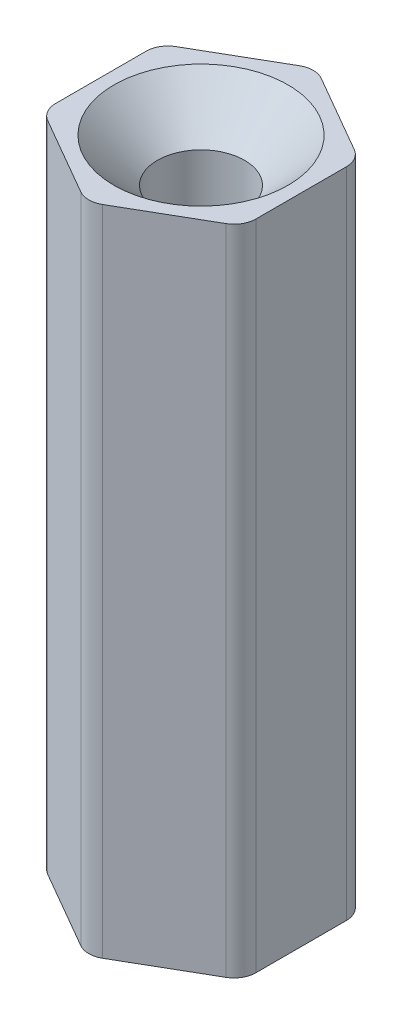
ISO-10303-21;
HEADER;
FILE_DESCRIPTION(('STEP AP214'),'2;1');
FILE_NAME('part.step','',(''),(''),'','','');
FILE_SCHEMA(('AUTOMOTIVE_DESIGN { 1 0 10303 214 1 1 1 1 }'));
ENDSEC;
DATA;
#1=APPLICATION_CONTEXT('core data for automotive mechanical design processes');
#2=APPLICATION_PROTOCOL_DEFINITION('international standard','automotive_design',2000,#1);
#3=PRODUCT_CONTEXT('',#1,'mechanical');
#4=PRODUCT('Part','Part','',(#3));
#5=PRODUCT_RELATED_PRODUCT_CATEGORY('part','',(#4));
#6=PRODUCT_DEFINITION_FORMATION('','',#4);
#7=PRODUCT_DEFINITION_CONTEXT('part definition',#1,'design');
#8=PRODUCT_DEFINITION('design','',#6,#7);
#9=PRODUCT_DEFINITION_SHAPE('','',#8);
#10=(LENGTH_UNIT() NAMED_UNIT(*) SI_UNIT(.MILLI.,.METRE.));
#11=(NAMED_UNIT(*) PLANE_ANGLE_UNIT() SI_UNIT($,.RADIAN.));
#12=(NAMED_UNIT(*) SI_UNIT($,.STERADIAN.) SOLID_ANGLE_UNIT());
#13=UNCERTAINTY_MEASURE_WITH_UNIT(LENGTH_MEASURE(1.E-05),#10,'distance_accuracy_value','');
#14=(GEOMETRIC_REPRESENTATION_CONTEXT(3) GLOBAL_UNCERTAINTY_ASSIGNED_CONTEXT((#13)) GLOBAL_UNIT_ASSIGNED_CONTEXT((#10,
#11,#12)) REPRESENTATION_CONTEXT('',''));
#15=CARTESIAN_POINT('',(0.,0.,0.));
#16=DIRECTION('',(0.,0.,1.));
#17=DIRECTION('',(1.,0.,0.));
#18=AXIS2_PLACEMENT_3D('',#15,#16,#17);
#19=CARTESIAN_POINT('',(2.29999999999999,15.,-1.32790561913617));
#20=DIRECTION('',(-0.499999999999995,0.,0.866025403784442));
#21=DIRECTION('',(0.866025403784442,0.,0.499999999999995));
#22=AXIS2_PLACEMENT_3D('',#19,#20,#21);
#23=PLANE('',#22);
#24=DIRECTION('',(-0.866025403784442,0.,-0.499999999999995));
#25=VECTOR('',#24,1.);
#26=CARTESIAN_POINT('',(2.29999999999999,0.,-1.32790561913617));
#27=LINE('',#26,#25);
#28=CARTESIAN_POINT('',(2.04999999999999,0.,-1.47224318643357));
#29=VERTEX_POINT('',#28);
#30=CARTESIAN_POINT('',(0.249999999999999,0.,-2.51147367097488));
#31=VERTEX_POINT('',#30);
#32=EDGE_CURVE('E212',#29,#31,#27,.T.);
#33=ORIENTED_EDGE('',*,*,#32,.T.);
#34=DIRECTION('',(0.,-1.,0.));
#35=VECTOR('',#34,1.);
#36=CARTESIAN_POINT('',(0.249999999999999,15.,-2.51147367097488));
#37=LINE('',#36,#35);
#38=CARTESIAN_POINT('',(0.249999999999999,15.,-2.51147367097488));
#39=VERTEX_POINT('',#38);
#40=EDGE_CURVE('E205',#31,#39,#37,.F.);
#41=ORIENTED_EDGE('',*,*,#40,.T.);
#42=DIRECTION('',(-0.866025403784442,0.,-0.499999999999995));
#43=VECTOR('',#42,1.);
#44=CARTESIAN_POINT('',(2.29999999999999,15.,-1.32790561913617));
#45=LINE('',#44,#43);
#46=CARTESIAN_POINT('',(2.04999999999999,15.,-1.47224318643357));
#47=VERTEX_POINT('',#46);
#48=EDGE_CURVE('E150',#47,#39,#45,.T.);
#49=ORIENTED_EDGE('',*,*,#48,.F.);
#50=DIRECTION('',(0.,-1.,0.));
#51=VECTOR('',#50,1.);
#52=CARTESIAN_POINT('',(2.04999999999999,15.,-1.47224318643357));
#53=LINE('',#52,#51);
#54=EDGE_CURVE('E202',#47,#29,#53,.T.);
#55=ORIENTED_EDGE('',*,*,#54,.T.);
#56=EDGE_LOOP('',(#33,#41,#49,#55));
#57=FACE_BOUND('',#56,.T.);
#58=ADVANCED_FACE('F33',(#57),#23,.F.);
#59=CARTESIAN_POINT('',(0.,15.,-2.65581123827228));
#60=DIRECTION('',(0.500000000000001,0.,0.866025403784438));
#61=DIRECTION('',(0.866025403784438,0.,-0.500000000000001));
#62=AXIS2_PLACEMENT_3D('',#59,#60,#61);
#63=PLANE('',#62);
#64=DIRECTION('',(-0.866025403784438,0.,0.500000000000001));
#65=VECTOR('',#64,1.);
#66=CARTESIAN_POINT('',(0.,0.,-2.65581123827228));
#67=LINE('',#66,#65);
#68=CARTESIAN_POINT('',(-0.249999999999998,0.,-2.51147367097488));
#69=VERTEX_POINT('',#68);
#70=CARTESIAN_POINT('',(-2.05000000000001,0.,-1.47224318643354));
#71=VERTEX_POINT('',#70);
#72=EDGE_CURVE('E236',#69,#71,#67,.T.);
#73=ORIENTED_EDGE('',*,*,#72,.T.);
#74=DIRECTION('',(0.,-1.,0.));
#75=VECTOR('',#74,1.);
#76=CARTESIAN_POINT('',(-2.05,15.,-1.47224318643354));
#77=LINE('',#76,#75);
#78=CARTESIAN_POINT('',(-2.05000000000001,15.,-1.47224318643354));
#79=VERTEX_POINT('',#78);
#80=EDGE_CURVE('E200',#71,#79,#77,.F.);
#81=ORIENTED_EDGE('',*,*,#80,.T.);
#82=DIRECTION('',(-0.866025403784438,0.,0.500000000000001));
#83=VECTOR('',#82,1.);
#84=CARTESIAN_POINT('',(0.,15.,-2.65581123827228));
#85=LINE('',#84,#83);
#86=CARTESIAN_POINT('',(-0.249999999999998,15.,-2.51147367097488));
#87=VERTEX_POINT('',#86);
#88=EDGE_CURVE('E222',#87,#79,#85,.T.);
#89=ORIENTED_EDGE('',*,*,#88,.F.);
#90=DIRECTION('',(0.,-1.,0.));
#91=VECTOR('',#90,1.);
#92=CARTESIAN_POINT('',(-0.249999999999998,15.,-2.51147367097488));
#93=LINE('',#92,#91);
#94=EDGE_CURVE('E197',#87,#69,#93,.T.);
#95=ORIENTED_EDGE('',*,*,#94,.T.);
#96=EDGE_LOOP('',(#73,#81,#89,#95));
#97=FACE_BOUND('',#96,.T.);
#98=ADVANCED_FACE('F260',(#97),#63,.F.);
#99=CARTESIAN_POINT('',(-2.30000000000001,15.,-1.32790561913614));
#100=DIRECTION('',(1.,0.,0.));
#101=DIRECTION('',(0.,0.,-1.));
#102=AXIS2_PLACEMENT_3D('',#99,#100,#101);
#103=PLANE('',#102);
#104=DIRECTION('',(0.,0.,1.));
#105=VECTOR('',#104,1.);
#106=CARTESIAN_POINT('',(-2.30000000000001,0.,-1.32790561913614));
#107=LINE('',#106,#105);
#108=CARTESIAN_POINT('',(-2.3,0.,-1.03923048454132));
#109=VERTEX_POINT('',#108);
#110=CARTESIAN_POINT('',(-2.3,0.,1.03923048454134));
#111=VERTEX_POINT('',#110);
#112=EDGE_CURVE('E152',#109,#111,#107,.T.);
#113=ORIENTED_EDGE('',*,*,#112,.T.);
#114=DIRECTION('',(0.,-1.,0.));
#115=VECTOR('',#114,1.);
#116=CARTESIAN_POINT('',(-2.3,15.,1.03923048454134));
#117=LINE('',#116,#115);
#118=CARTESIAN_POINT('',(-2.3,15.,1.03923048454134));
#119=VERTEX_POINT('',#118);
#120=EDGE_CURVE('E195',#111,#119,#117,.F.);
#121=ORIENTED_EDGE('',*,*,#120,.T.);
#122=DIRECTION('',(0.,0.,1.));
#123=VECTOR('',#122,1.);
#124=CARTESIAN_POINT('',(-2.30000000000001,15.,-1.32790561913614));
#125=LINE('',#124,#123);
#126=CARTESIAN_POINT('',(-2.3,15.,-1.03923048454132));
#127=VERTEX_POINT('',#126);
#128=EDGE_CURVE('E225',#127,#119,#125,.T.);
#129=ORIENTED_EDGE('',*,*,#128,.F.);
#130=DIRECTION('',(0.,-1.,0.));
#131=VECTOR('',#130,1.);
#132=CARTESIAN_POINT('',(-2.3,15.,-1.03923048454132));
#133=LINE('',#132,#131);
#134=EDGE_CURVE('E192',#127,#109,#133,.T.);
#135=ORIENTED_EDGE('',*,*,#134,.T.);
#136=EDGE_LOOP('',(#113,#121,#129,#135));
#137=FACE_BOUND('',#136,.T.);
#138=ADVANCED_FACE('F242',(#137),#103,.F.);
#139=CARTESIAN_POINT('',(-2.3,15.,1.32790561913615));
#140=DIRECTION('',(0.499999999999995,0.,-0.866025403784442));
#141=DIRECTION('',(-0.866025403784442,0.,-0.499999999999995));
#142=AXIS2_PLACEMENT_3D('',#139,#140,#141);
#143=PLANE('',#142);
#144=DIRECTION('',(0.866025403784442,0.,0.499999999999995));
#145=VECTOR('',#144,1.);
#146=CARTESIAN_POINT('',(-2.3,0.,1.32790561913615));
#147=LINE('',#146,#145);
#148=CARTESIAN_POINT('',(-2.04999999999999,0.,1.47224318643356));
#149=VERTEX_POINT('',#148);
#150=CARTESIAN_POINT('',(-0.249999999999982,0.,2.51147367097488));
#151=VERTEX_POINT('',#150);
#152=EDGE_CURVE('E148',#149,#151,#147,.T.);
#153=ORIENTED_EDGE('',*,*,#152,.T.);
#154=DIRECTION('',(0.,-1.,0.));
#155=VECTOR('',#154,1.);
#156=CARTESIAN_POINT('',(-0.249999999999982,15.,2.51147367097488));
#157=LINE('',#156,#155);
#158=CARTESIAN_POINT('',(-0.249999999999982,15.,2.51147367097488));
#159=VERTEX_POINT('',#158);
#160=EDGE_CURVE('E127',#151,#159,#157,.F.);
#161=ORIENTED_EDGE('',*,*,#160,.T.);
#162=DIRECTION('',(0.866025403784442,0.,0.499999999999995));
#163=VECTOR('',#162,1.);
#164=CARTESIAN_POINT('',(-2.3,15.,1.32790561913615));
#165=LINE('',#164,#163);
#166=CARTESIAN_POINT('',(-2.04999999999999,15.,1.47224318643356));
#167=VERTEX_POINT('',#166);
#168=EDGE_CURVE('E230',#167,#159,#165,.T.);
#169=ORIENTED_EDGE('',*,*,#168,.F.);
#170=DIRECTION('',(0.,-1.,0.));
#171=VECTOR('',#170,1.);
#172=CARTESIAN_POINT('',(-2.04999999999999,15.,1.47224318643356));
#173=LINE('',#172,#171);
#174=EDGE_CURVE('E132',#167,#149,#173,.T.);
#175=ORIENTED_EDGE('',*,*,#174,.T.);
#176=EDGE_LOOP('',(#153,#161,#169,#175));
#177=FACE_BOUND('',#176,.T.);
#178=ADVANCED_FACE('F252',(#177),#143,.F.);
#179=CARTESIAN_POINT('',(0.,15.,2.65581123827228));
#180=DIRECTION('',(-0.500000000000007,0.,-0.866025403784434));
#181=DIRECTION('',(-0.866025403784435,0.,0.500000000000007));
#182=AXIS2_PLACEMENT_3D('',#179,#180,#181);
#183=PLANE('',#182);
#184=DIRECTION('',(0.866025403784435,0.,-0.500000000000007));
#185=VECTOR('',#184,1.);
#186=CARTESIAN_POINT('',(0.,15.,2.65581123827228));
#187=LINE('',#186,#185);
#188=CARTESIAN_POINT('',(0.250000000000018,15.,2.51147367097487));
#189=VERTEX_POINT('',#188);
#190=CARTESIAN_POINT('',(2.05000000000001,15.,1.47224318643353));
#191=VERTEX_POINT('',#190);
#192=EDGE_CURVE('E141',#189,#191,#187,.T.);
#193=ORIENTED_EDGE('',*,*,#192,.F.);
#194=DIRECTION('',(0.,-1.,0.));
#195=VECTOR('',#194,1.);
#196=CARTESIAN_POINT('',(0.250000000000018,15.,2.51147367097487));
#197=LINE('',#196,#195);
#198=CARTESIAN_POINT('',(0.250000000000018,0.,2.51147367097487));
#199=VERTEX_POINT('',#198);
#200=EDGE_CURVE('E126',#189,#199,#197,.T.);
#201=ORIENTED_EDGE('',*,*,#200,.T.);
#202=DIRECTION('',(0.866025403784435,0.,-0.500000000000007));
#203=VECTOR('',#202,1.);
#204=CARTESIAN_POINT('',(0.,0.,2.65581123827228));
#205=LINE('',#204,#203);
#206=CARTESIAN_POINT('',(2.05000000000001,0.,1.47224318643353));
#207=VERTEX_POINT('',#206);
#208=EDGE_CURVE('E139',#199,#207,#205,.T.);
#209=ORIENTED_EDGE('',*,*,#208,.T.);
#210=DIRECTION('',(0.,-1.,0.));
#211=VECTOR('',#210,1.);
#212=CARTESIAN_POINT('',(2.05000000000001,15.,1.47224318643353));
#213=LINE('',#212,#211);
#214=EDGE_CURVE('E143',#207,#191,#213,.F.);
#215=ORIENTED_EDGE('',*,*,#214,.T.);
#216=EDGE_LOOP('',(#193,#201,#209,#215));
#217=FACE_BOUND('',#216,.T.);
#218=ADVANCED_FACE('F138',(#217),#183,.F.);
#219=CARTESIAN_POINT('',(2.30000000000001,15.,1.32790561913612));
#220=DIRECTION('',(-1.,0.,0.));
#221=DIRECTION('',(0.,0.,1.));
#222=AXIS2_PLACEMENT_3D('',#219,#220,#221);
#223=PLANE('',#222);
#224=DIRECTION('',(0.,0.,-1.));
#225=VECTOR('',#224,1.);
#226=CARTESIAN_POINT('',(2.30000000000001,0.,1.32790561913612));
#227=LINE('',#226,#225);
#228=CARTESIAN_POINT('',(2.30000000000001,0.,1.03923048454131));
#229=VERTEX_POINT('',#228);
#230=CARTESIAN_POINT('',(2.29999999999999,0.,-1.03923048454136));
#231=VERTEX_POINT('',#230);
#232=EDGE_CURVE('E147',#229,#231,#227,.T.);
#233=ORIENTED_EDGE('',*,*,#232,.T.);
#234=DIRECTION('',(0.,-1.,0.));
#235=VECTOR('',#234,1.);
#236=CARTESIAN_POINT('',(2.29999999999999,15.,-1.03923048454136));
#237=LINE('',#236,#235);
#238=CARTESIAN_POINT('',(2.29999999999999,15.,-1.03923048454136));
#239=VERTEX_POINT('',#238);
#240=EDGE_CURVE('E11',#231,#239,#237,.F.);
#241=ORIENTED_EDGE('',*,*,#240,.T.);
#242=DIRECTION('',(0.,0.,-1.));
#243=VECTOR('',#242,1.);
#244=CARTESIAN_POINT('',(2.30000000000001,15.,1.32790561913612));
#245=LINE('',#244,#243);
#246=CARTESIAN_POINT('',(2.30000000000001,15.,1.03923048454131));
#247=VERTEX_POINT('',#246);
#248=EDGE_CURVE('E160',#247,#239,#245,.T.);
#249=ORIENTED_EDGE('',*,*,#248,.F.);
#250=DIRECTION('',(0.,-1.,0.));
#251=VECTOR('',#250,1.);
#252=CARTESIAN_POINT('',(2.30000000000001,15.,1.03923048454131));
#253=LINE('',#252,#251);
#254=EDGE_CURVE('E41',#247,#229,#253,.T.);
#255=ORIENTED_EDGE('',*,*,#254,.T.);
#256=EDGE_LOOP('',(#233,#241,#249,#255));
#257=FACE_BOUND('',#256,.T.);
#258=ADVANCED_FACE('F208',(#257),#223,.F.);
#259=CARTESIAN_POINT('',(0.,15.,0.));
#260=DIRECTION('',(0.,1.,0.));
#261=DIRECTION('',(0.,0.,1.));
#262=AXIS2_PLACEMENT_3D('',#259,#260,#261);
#263=PLANE('',#262);
#264=CARTESIAN_POINT('',(0.,15.,0.));
#265=DIRECTION('',(0.,1.,0.));
#266=DIRECTION('',(0.,0.,1.));
#267=AXIS2_PLACEMENT_3D('',#264,#265,#266);
#268=CIRCLE('',#267,2.);
#269=CARTESIAN_POINT('',(0.,15.,2.));
#270=VERTEX_POINT('',#269);
#271=EDGE_CURVE('E166',#270,#270,#268,.F.);
#272=ORIENTED_EDGE('',*,*,#271,.T.);
#273=EDGE_LOOP('',(#272));
#274=FACE_BOUND('',#273,.T.);
#275=ORIENTED_EDGE('',*,*,#168,.T.);
#276=CARTESIAN_POINT('',(0.,15.,2.07846096908266));
#277=DIRECTION('',(0.,1.,0.));
#278=DIRECTION('',(0.,0.,1.));
#279=AXIS2_PLACEMENT_3D('',#276,#277,#278);
#280=CIRCLE('',#279,0.5);
#281=EDGE_CURVE('E190',#159,#189,#280,.T.);
#282=ORIENTED_EDGE('',*,*,#281,.T.);
#283=ORIENTED_EDGE('',*,*,#192,.T.);
#284=CARTESIAN_POINT('',(1.80000000000001,15.,1.03923048454131));
#285=DIRECTION('',(0.,1.,0.));
#286=DIRECTION('',(0.,0.,1.));
#287=AXIS2_PLACEMENT_3D('',#284,#285,#286);
#288=CIRCLE('',#287,0.5);
#289=EDGE_CURVE('E53',#191,#247,#288,.T.);
#290=ORIENTED_EDGE('',*,*,#289,.T.);
#291=ORIENTED_EDGE('',*,*,#248,.T.);
#292=CARTESIAN_POINT('',(1.79999999999999,15.,-1.03923048454135));
#293=DIRECTION('',(0.,1.,0.));
#294=DIRECTION('',(0.,0.,1.));
#295=AXIS2_PLACEMENT_3D('',#292,#293,#294);
#296=CIRCLE('',#295,0.5);
#297=EDGE_CURVE('E182',#239,#47,#296,.T.);
#298=ORIENTED_EDGE('',*,*,#297,.T.);
#299=ORIENTED_EDGE('',*,*,#48,.T.);
#300=CARTESIAN_POINT('',(0.,15.,-2.07846096908266));
#301=DIRECTION('',(0.,1.,0.));
#302=DIRECTION('',(0.,0.,1.));
#303=AXIS2_PLACEMENT_3D('',#300,#301,#302);
#304=CIRCLE('',#303,0.5);
#305=EDGE_CURVE('E184',#39,#87,#304,.T.);
#306=ORIENTED_EDGE('',*,*,#305,.T.);
#307=ORIENTED_EDGE('',*,*,#88,.T.);
#308=CARTESIAN_POINT('',(-1.8,15.,-1.03923048454132));
#309=DIRECTION('',(0.,1.,0.));
#310=DIRECTION('',(0.,0.,1.));
#311=AXIS2_PLACEMENT_3D('',#308,#309,#310);
#312=CIRCLE('',#311,0.5);
#313=EDGE_CURVE('E186',#79,#127,#312,.T.);
#314=ORIENTED_EDGE('',*,*,#313,.T.);
#315=ORIENTED_EDGE('',*,*,#128,.T.);
#316=CARTESIAN_POINT('',(-1.8,15.,1.03923048454134));
#317=DIRECTION('',(0.,1.,0.));
#318=DIRECTION('',(0.,0.,1.));
#319=AXIS2_PLACEMENT_3D('',#316,#317,#318);
#320=CIRCLE('',#319,0.5);
#321=EDGE_CURVE('E188',#119,#167,#320,.T.);
#322=ORIENTED_EDGE('',*,*,#321,.T.);
#323=EDGE_LOOP('',(#275,#282,#283,#290,#291,#298,#299,#306,#307,#314,#315,#322));
#324=FACE_BOUND('',#323,.T.);
#325=ADVANCED_FACE('F250',(#274,#324),#263,.T.);
#326=CARTESIAN_POINT('',(0.,0.,0.));
#327=DIRECTION('',(0.,1.,0.));
#328=DIRECTION('',(0.,0.,1.));
#329=AXIS2_PLACEMENT_3D('',#326,#327,#328);
#330=PLANE('',#329);
#331=CARTESIAN_POINT('',(0.,0.,0.));
#332=DIRECTION('',(0.,1.,0.));
#333=DIRECTION('',(0.,0.,1.));
#334=AXIS2_PLACEMENT_3D('',#331,#332,#333);
#335=CIRCLE('',#334,2.);
#336=CARTESIAN_POINT('',(0.,0.,2.));
#337=VERTEX_POINT('',#336);
#338=EDGE_CURVE('E156',#337,#337,#335,.T.);
#339=ORIENTED_EDGE('',*,*,#338,.T.);
#340=EDGE_LOOP('',(#339));
#341=FACE_BOUND('',#340,.T.);
#342=ORIENTED_EDGE('',*,*,#208,.F.);
#343=CARTESIAN_POINT('',(0.,0.,2.07846096908266));
#344=DIRECTION('',(0.,1.,0.));
#345=DIRECTION('',(0.,0.,1.));
#346=AXIS2_PLACEMENT_3D('',#343,#344,#345);
#347=CIRCLE('',#346,0.5);
#348=EDGE_CURVE('E122',#199,#151,#347,.F.);
#349=ORIENTED_EDGE('',*,*,#348,.T.);
#350=ORIENTED_EDGE('',*,*,#152,.F.);
#351=CARTESIAN_POINT('',(-1.8,0.,1.03923048454134));
#352=DIRECTION('',(0.,1.,0.));
#353=DIRECTION('',(0.,0.,1.));
#354=AXIS2_PLACEMENT_3D('',#351,#352,#353);
#355=CIRCLE('',#354,0.5);
#356=EDGE_CURVE('E133',#149,#111,#355,.F.);
#357=ORIENTED_EDGE('',*,*,#356,.T.);
#358=ORIENTED_EDGE('',*,*,#112,.F.);
#359=CARTESIAN_POINT('',(-1.8,0.,-1.03923048454132));
#360=DIRECTION('',(0.,1.,0.));
#361=DIRECTION('',(0.,0.,1.));
#362=AXIS2_PLACEMENT_3D('',#359,#360,#361);
#363=CIRCLE('',#362,0.5);
#364=EDGE_CURVE('E175',#109,#71,#363,.F.);
#365=ORIENTED_EDGE('',*,*,#364,.T.);
#366=ORIENTED_EDGE('',*,*,#72,.F.);
#367=CARTESIAN_POINT('',(0.,0.,-2.07846096908266));
#368=DIRECTION('',(0.,1.,0.));
#369=DIRECTION('',(0.,0.,1.));
#370=AXIS2_PLACEMENT_3D('',#367,#368,#369);
#371=CIRCLE('',#370,0.5);
#372=EDGE_CURVE('E173',#69,#31,#371,.F.);
#373=ORIENTED_EDGE('',*,*,#372,.T.);
#374=ORIENTED_EDGE('',*,*,#32,.F.);
#375=CARTESIAN_POINT('',(1.79999999999999,0.,-1.03923048454135));
#376=DIRECTION('',(0.,1.,0.));
#377=DIRECTION('',(0.,0.,1.));
#378=AXIS2_PLACEMENT_3D('',#375,#376,#377);
#379=CIRCLE('',#378,0.5);
#380=EDGE_CURVE('E171',#29,#231,#379,.F.);
#381=ORIENTED_EDGE('',*,*,#380,.T.);
#382=ORIENTED_EDGE('',*,*,#232,.F.);
#383=CARTESIAN_POINT('',(1.80000000000001,0.,1.03923048454131));
#384=DIRECTION('',(0.,1.,0.));
#385=DIRECTION('',(0.,0.,1.));
#386=AXIS2_PLACEMENT_3D('',#383,#384,#385);
#387=CIRCLE('',#386,0.5);
#388=EDGE_CURVE('E142',#229,#207,#387,.F.);
#389=ORIENTED_EDGE('',*,*,#388,.T.);
#390=EDGE_LOOP('',(#342,#349,#350,#357,#358,#365,#366,#373,#374,#381,#382,#389));
#391=FACE_BOUND('',#390,.T.);
#392=ADVANCED_FACE('F145',(#341,#391),#330,.F.);
#393=CARTESIAN_POINT('',(0.,0.,0.));
#394=DIRECTION('',(0.,1.,0.));
#395=DIRECTION('',(0.,0.,1.));
#396=AXIS2_PLACEMENT_3D('',#393,#394,#395);
#397=CYLINDRICAL_SURFACE('',#396,1.);
#398=CARTESIAN_POINT('',(0.,1.,0.));
#399=DIRECTION('',(0.,1.,0.));
#400=DIRECTION('',(0.,0.,1.));
#401=AXIS2_PLACEMENT_3D('',#398,#399,#400);
#402=CIRCLE('',#401,1.);
#403=CARTESIAN_POINT('',(0.,1.,1.));
#404=VERTEX_POINT('',#403);
#405=EDGE_CURVE('E163',#404,#404,#402,.F.);
#406=ORIENTED_EDGE('',*,*,#405,.T.);
#407=EDGE_LOOP('',(#406));
#408=FACE_BOUND('',#407,.T.);
#409=CARTESIAN_POINT('',(0.,14.,0.));
#410=DIRECTION('',(0.,1.,0.));
#411=DIRECTION('',(0.,0.,1.));
#412=AXIS2_PLACEMENT_3D('',#409,#410,#411);
#413=CIRCLE('',#412,1.);
#414=CARTESIAN_POINT('',(0.,14.,1.));
#415=VERTEX_POINT('',#414);
#416=EDGE_CURVE('E159',#415,#415,#413,.T.);
#417=ORIENTED_EDGE('',*,*,#416,.T.);
#418=EDGE_LOOP('',(#417));
#419=FACE_BOUND('',#418,.T.);
#420=ADVANCED_FACE('F274',(#408,#419),#397,.F.);
#421=CARTESIAN_POINT('',(0.,0.,0.));
#422=DIRECTION('',(0.,-1.,0.));
#423=DIRECTION('',(0.,0.,-1.));
#424=AXIS2_PLACEMENT_3D('',#421,#422,#423);
#425=CONICAL_SURFACE('',#424,2.,0.785398163397447);
#426=ORIENTED_EDGE('',*,*,#405,.F.);
#427=EDGE_LOOP('',(#426));
#428=FACE_BOUND('',#427,.T.);
#429=ORIENTED_EDGE('',*,*,#338,.F.);
#430=EDGE_LOOP('',(#429));
#431=FACE_BOUND('',#430,.T.);
#432=ADVANCED_FACE('F270',(#428,#431),#425,.F.);
#433=CARTESIAN_POINT('',(0.,14.,0.));
#434=DIRECTION('',(0.,1.,0.));
#435=DIRECTION('',(0.,0.,1.));
#436=AXIS2_PLACEMENT_3D('',#433,#434,#435);
#437=CONICAL_SURFACE('',#436,1.,0.78539816339745);
#438=ORIENTED_EDGE('',*,*,#271,.F.);
#439=EDGE_LOOP('',(#438));
#440=FACE_BOUND('',#439,.T.);
#441=ORIENTED_EDGE('',*,*,#416,.F.);
#442=EDGE_LOOP('',(#441));
#443=FACE_BOUND('',#442,.T.);
#444=ADVANCED_FACE('F273',(#440,#443),#437,.F.);
#445=CARTESIAN_POINT('',(0.,15.,2.07846096908266));
#446=DIRECTION('',(0.,-1.,0.));
#447=DIRECTION('',(0.,0.,-1.));
#448=AXIS2_PLACEMENT_3D('',#445,#446,#447);
#449=CYLINDRICAL_SURFACE('',#448,0.5);
#450=ORIENTED_EDGE('',*,*,#281,.F.);
#451=ORIENTED_EDGE('',*,*,#160,.F.);
#452=ORIENTED_EDGE('',*,*,#348,.F.);
#453=ORIENTED_EDGE('',*,*,#200,.F.);
#454=EDGE_LOOP('',(#450,#451,#452,#453));
#455=FACE_BOUND('',#454,.T.);
#456=ADVANCED_FACE('F125',(#455),#449,.T.);
#457=CARTESIAN_POINT('',(-1.8,15.,1.03923048454134));
#458=DIRECTION('',(0.,-1.,0.));
#459=DIRECTION('',(0.,0.,-1.));
#460=AXIS2_PLACEMENT_3D('',#457,#458,#459);
#461=CYLINDRICAL_SURFACE('',#460,0.5);
#462=ORIENTED_EDGE('',*,*,#321,.F.);
#463=ORIENTED_EDGE('',*,*,#120,.F.);
#464=ORIENTED_EDGE('',*,*,#356,.F.);
#465=ORIENTED_EDGE('',*,*,#174,.F.);
#466=EDGE_LOOP('',(#462,#463,#464,#465));
#467=FACE_BOUND('',#466,.T.);
#468=ADVANCED_FACE('F247',(#467),#461,.T.);
#469=CARTESIAN_POINT('',(-1.8,15.,-1.03923048454132));
#470=DIRECTION('',(0.,-1.,0.));
#471=DIRECTION('',(0.,0.,-1.));
#472=AXIS2_PLACEMENT_3D('',#469,#470,#471);
#473=CYLINDRICAL_SURFACE('',#472,0.5);
#474=ORIENTED_EDGE('',*,*,#313,.F.);
#475=ORIENTED_EDGE('',*,*,#80,.F.);
#476=ORIENTED_EDGE('',*,*,#364,.F.);
#477=ORIENTED_EDGE('',*,*,#134,.F.);
#478=EDGE_LOOP('',(#474,#475,#476,#477));
#479=FACE_BOUND('',#478,.T.);
#480=ADVANCED_FACE('F283',(#479),#473,.T.);
#481=CARTESIAN_POINT('',(0.,15.,-2.07846096908266));
#482=DIRECTION('',(0.,-1.,0.));
#483=DIRECTION('',(0.,0.,-1.));
#484=AXIS2_PLACEMENT_3D('',#481,#482,#483);
#485=CYLINDRICAL_SURFACE('',#484,0.5);
#486=ORIENTED_EDGE('',*,*,#305,.F.);
#487=ORIENTED_EDGE('',*,*,#40,.F.);
#488=ORIENTED_EDGE('',*,*,#372,.F.);
#489=ORIENTED_EDGE('',*,*,#94,.F.);
#490=EDGE_LOOP('',(#486,#487,#488,#489));
#491=FACE_BOUND('',#490,.T.);
#492=ADVANCED_FACE('F286',(#491),#485,.T.);
#493=CARTESIAN_POINT('',(1.79999999999999,15.,-1.03923048454135));
#494=DIRECTION('',(0.,-1.,0.));
#495=DIRECTION('',(0.,0.,-1.));
#496=AXIS2_PLACEMENT_3D('',#493,#494,#495);
#497=CYLINDRICAL_SURFACE('',#496,0.5);
#498=ORIENTED_EDGE('',*,*,#297,.F.);
#499=ORIENTED_EDGE('',*,*,#240,.F.);
#500=ORIENTED_EDGE('',*,*,#380,.F.);
#501=ORIENTED_EDGE('',*,*,#54,.F.);
#502=EDGE_LOOP('',(#498,#499,#500,#501));
#503=FACE_BOUND('',#502,.T.);
#504=ADVANCED_FACE('F216',(#503),#497,.T.);
#505=CARTESIAN_POINT('',(1.80000000000001,15.,1.03923048454131));
#506=DIRECTION('',(0.,-1.,0.));
#507=DIRECTION('',(0.,0.,-1.));
#508=AXIS2_PLACEMENT_3D('',#505,#506,#507);
#509=CYLINDRICAL_SURFACE('',#508,0.5);
#510=ORIENTED_EDGE('',*,*,#289,.F.);
#511=ORIENTED_EDGE('',*,*,#214,.F.);
#512=ORIENTED_EDGE('',*,*,#388,.F.);
#513=ORIENTED_EDGE('',*,*,#254,.F.);
#514=EDGE_LOOP('',(#510,#511,#512,#513));
#515=FACE_BOUND('',#514,.T.);
#516=ADVANCED_FACE('F35',(#515),#509,.T.);
#517=CLOSED_SHELL('',(#58,#98,#138,#178,#218,#258,#325,#392,#420,#432,#444,#456,#468,#480,#492,
#504,#516));
#518=MANIFOLD_SOLID_BREP('B2',#517);
#519=ADVANCED_BREP_SHAPE_REPRESENTATION('',(#18,#518),#14);
#520=SHAPE_DEFINITION_REPRESENTATION(#9,#519);
ENDSEC;
END-ISO-10303-21;
